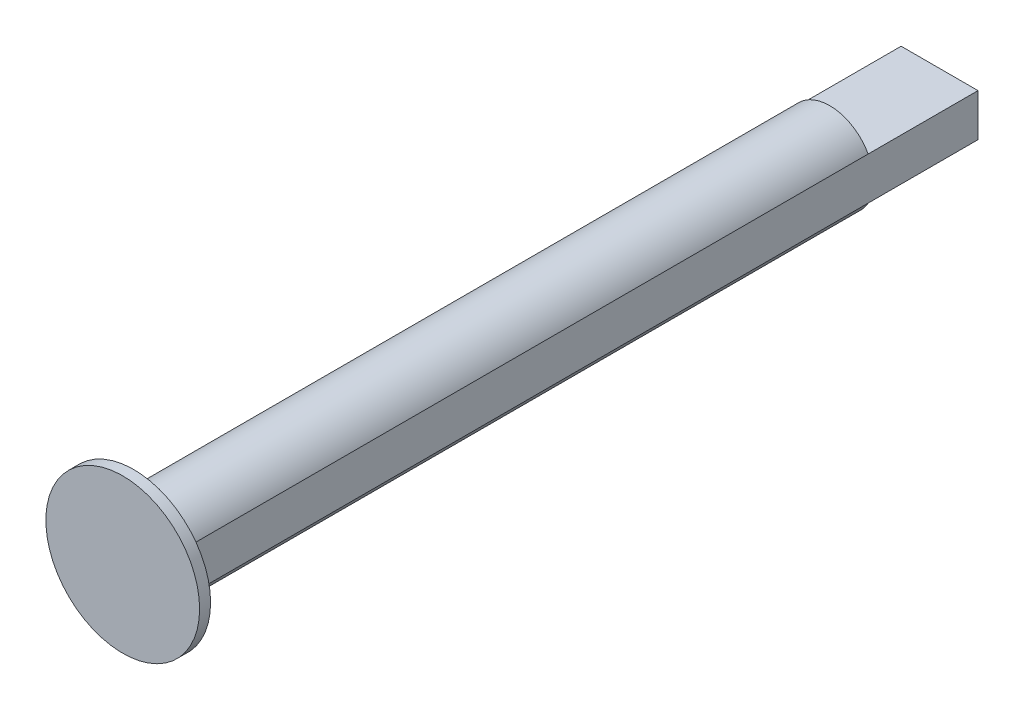
ISO-10303-21;
HEADER;
FILE_DESCRIPTION(('STEP AP214'),'2;1');
FILE_NAME('part.step','',(''),(''),'','','');
FILE_SCHEMA(('AUTOMOTIVE_DESIGN { 1 0 10303 214 1 1 1 1 }'));
ENDSEC;
DATA;
#1=APPLICATION_CONTEXT('core data for automotive mechanical design processes');
#2=APPLICATION_PROTOCOL_DEFINITION('international standard','automotive_design',2000,#1);
#3=PRODUCT_CONTEXT('',#1,'mechanical');
#4=PRODUCT('Part','Part','',(#3));
#5=PRODUCT_RELATED_PRODUCT_CATEGORY('part','',(#4));
#6=PRODUCT_DEFINITION_FORMATION('','',#4);
#7=PRODUCT_DEFINITION_CONTEXT('part definition',#1,'design');
#8=PRODUCT_DEFINITION('design','',#6,#7);
#9=PRODUCT_DEFINITION_SHAPE('','',#8);
#10=(LENGTH_UNIT() NAMED_UNIT(*) SI_UNIT(.MILLI.,.METRE.));
#11=(NAMED_UNIT(*) PLANE_ANGLE_UNIT() SI_UNIT($,.RADIAN.));
#12=(NAMED_UNIT(*) SI_UNIT($,.STERADIAN.) SOLID_ANGLE_UNIT());
#13=UNCERTAINTY_MEASURE_WITH_UNIT(LENGTH_MEASURE(1.E-05),#10,'distance_accuracy_value','');
#14=(GEOMETRIC_REPRESENTATION_CONTEXT(3) GLOBAL_UNCERTAINTY_ASSIGNED_CONTEXT((#13)) GLOBAL_UNIT_ASSIGNED_CONTEXT((#10,
#11,#12)) REPRESENTATION_CONTEXT('',''));
#15=CARTESIAN_POINT('',(0.,0.,0.));
#16=DIRECTION('',(0.,0.,1.));
#17=DIRECTION('',(1.,0.,0.));
#18=AXIS2_PLACEMENT_3D('',#15,#16,#17);
#19=CARTESIAN_POINT('',(0.,0.,-73.3796339));
#20=DIRECTION('',(0.,0.,1.));
#21=DIRECTION('',(1.,0.,0.));
#22=AXIS2_PLACEMENT_3D('',#19,#20,#21);
#23=CYLINDRICAL_SURFACE('',#22,4.);
#24=DIRECTION('',(0.,0.,-1.));
#25=VECTOR('',#24,1.);
#26=CARTESIAN_POINT('',(-3.5,-1.93649167310371,-63.3796339));
#27=LINE('',#26,#25);
#28=CARTESIAN_POINT('',(-3.5,-1.93649167310371,-63.3796339));
#29=VERTEX_POINT('',#28);
#30=CARTESIAN_POINT('',(-3.5,-1.93649167310371,-73.3796339));
#31=VERTEX_POINT('',#30);
#32=EDGE_CURVE('E60',#29,#31,#27,.T.);
#33=ORIENTED_EDGE('',*,*,#32,.F.);
#34=CARTESIAN_POINT('',(0.,0.,-63.3796339));
#35=DIRECTION('',(0.,0.,-1.));
#36=DIRECTION('',(-1.,0.,0.));
#37=AXIS2_PLACEMENT_3D('',#34,#35,#36);
#38=CIRCLE('',#37,4.);
#39=CARTESIAN_POINT('',(3.5,-1.93649167310371,-63.3796339));
#40=VERTEX_POINT('',#39);
#41=EDGE_CURVE('E92',#40,#29,#38,.T.);
#42=ORIENTED_EDGE('',*,*,#41,.F.);
#43=DIRECTION('',(0.,0.,1.));
#44=VECTOR('',#43,1.);
#45=CARTESIAN_POINT('',(3.5,-1.93649167310371,-73.3796339));
#46=LINE('',#45,#44);
#47=CARTESIAN_POINT('',(3.5,-1.93649167310371,0.));
#48=VERTEX_POINT('',#47);
#49=EDGE_CURVE('E141',#40,#48,#46,.T.);
#50=ORIENTED_EDGE('',*,*,#49,.T.);
#51=CARTESIAN_POINT('',(0.,0.,0.));
#52=DIRECTION('',(0.,0.,1.));
#53=DIRECTION('',(1.,0.,0.));
#54=AXIS2_PLACEMENT_3D('',#51,#52,#53);
#55=CIRCLE('',#54,4.);
#56=CARTESIAN_POINT('',(3.5,1.93649167310371,0.));
#57=VERTEX_POINT('',#56);
#58=EDGE_CURVE('E132',#57,#48,#55,.T.);
#59=ORIENTED_EDGE('',*,*,#58,.F.);
#60=DIRECTION('',(0.,0.,1.));
#61=VECTOR('',#60,1.);
#62=CARTESIAN_POINT('',(3.5,1.93649167310371,-73.3796339));
#63=LINE('',#62,#61);
#64=CARTESIAN_POINT('',(3.5,1.93649167310371,-63.3796339));
#65=VERTEX_POINT('',#64);
#66=EDGE_CURVE('E53',#65,#57,#63,.T.);
#67=ORIENTED_EDGE('',*,*,#66,.F.);
#68=CARTESIAN_POINT('',(0.,0.,-63.3796339));
#69=DIRECTION('',(0.,0.,-1.));
#70=DIRECTION('',(-1.,0.,0.));
#71=AXIS2_PLACEMENT_3D('',#68,#69,#70);
#72=CIRCLE('',#71,4.);
#73=CARTESIAN_POINT('',(-3.5,1.93649167310371,-63.3796339));
#74=VERTEX_POINT('',#73);
#75=EDGE_CURVE('E124',#74,#65,#72,.T.);
#76=ORIENTED_EDGE('',*,*,#75,.F.);
#77=DIRECTION('',(0.,0.,-1.));
#78=VECTOR('',#77,1.);
#79=CARTESIAN_POINT('',(-3.5,1.93649167310371,-63.3796339));
#80=LINE('',#79,#78);
#81=CARTESIAN_POINT('',(-3.5,1.93649167310371,-73.3796339));
#82=VERTEX_POINT('',#81);
#83=EDGE_CURVE('E117',#74,#82,#80,.T.);
#84=ORIENTED_EDGE('',*,*,#83,.T.);
#85=CARTESIAN_POINT('',(0.,0.,-73.3796339));
#86=DIRECTION('',(0.,0.,1.));
#87=DIRECTION('',(1.,0.,0.));
#88=AXIS2_PLACEMENT_3D('',#85,#86,#87);
#89=CIRCLE('',#88,4.);
#90=EDGE_CURVE('E107',#82,#31,#89,.T.);
#91=ORIENTED_EDGE('',*,*,#90,.T.);
#92=EDGE_LOOP('',(#33,#42,#50,#59,#67,#76,#84,#91));
#93=FACE_BOUND('',#92,.T.);
#94=ADVANCED_FACE('F44',(#93),#23,.T.);
#95=CARTESIAN_POINT('',(3.5,-1.93649167310371,-73.3796339));
#96=DIRECTION('',(1.,0.,0.));
#97=DIRECTION('',(0.,0.,-1.));
#98=AXIS2_PLACEMENT_3D('',#95,#96,#97);
#99=PLANE('',#98);
#100=DIRECTION('',(0.,1.,0.));
#101=VECTOR('',#100,1.);
#102=CARTESIAN_POINT('',(3.5,-1.93649167310371,0.));
#103=LINE('',#102,#101);
#104=EDGE_CURVE('E137',#48,#57,#103,.T.);
#105=ORIENTED_EDGE('',*,*,#104,.F.);
#106=ORIENTED_EDGE('',*,*,#49,.F.);
#107=CARTESIAN_POINT('',(3.5,-1.93649167310371,-73.3796339));
#108=VERTEX_POINT('',#107);
#109=EDGE_CURVE('E47',#108,#40,#46,.T.);
#110=ORIENTED_EDGE('',*,*,#109,.F.);
#111=DIRECTION('',(0.,1.,0.));
#112=VECTOR('',#111,1.);
#113=CARTESIAN_POINT('',(3.5,-1.93649167310371,-73.3796339));
#114=LINE('',#113,#112);
#115=CARTESIAN_POINT('',(3.5,1.93649167310371,-73.3796339));
#116=VERTEX_POINT('',#115);
#117=EDGE_CURVE('E136',#108,#116,#114,.T.);
#118=ORIENTED_EDGE('',*,*,#117,.T.);
#119=EDGE_CURVE('E11',#116,#65,#63,.T.);
#120=ORIENTED_EDGE('',*,*,#119,.T.);
#121=ORIENTED_EDGE('',*,*,#66,.T.);
#122=EDGE_LOOP('',(#105,#106,#110,#118,#120,#121));
#123=FACE_BOUND('',#122,.T.);
#124=ADVANCED_FACE('F152',(#123),#99,.T.);
#125=CARTESIAN_POINT('',(0.,0.,-73.3796339));
#126=DIRECTION('',(0.,0.,1.));
#127=DIRECTION('',(1.,0.,0.));
#128=AXIS2_PLACEMENT_3D('',#125,#126,#127);
#129=PLANE('',#128);
#130=ORIENTED_EDGE('',*,*,#117,.F.);
#131=DIRECTION('',(1.,0.,0.));
#132=VECTOR('',#131,1.);
#133=CARTESIAN_POINT('',(3.5,-1.93649167310371,-73.3796339));
#134=LINE('',#133,#132);
#135=EDGE_CURVE('E98',#31,#108,#134,.T.);
#136=ORIENTED_EDGE('',*,*,#135,.F.);
#137=ORIENTED_EDGE('',*,*,#90,.F.);
#138=DIRECTION('',(-1.,0.,0.));
#139=VECTOR('',#138,1.);
#140=CARTESIAN_POINT('',(3.5,1.93649167310371,-73.3796339));
#141=LINE('',#140,#139);
#142=EDGE_CURVE('E121',#116,#82,#141,.T.);
#143=ORIENTED_EDGE('',*,*,#142,.F.);
#144=EDGE_LOOP('',(#130,#136,#137,#143));
#145=FACE_BOUND('',#144,.T.);
#146=ADVANCED_FACE('F163',(#145),#129,.F.);
#147=CARTESIAN_POINT('',(0.,0.,0.));
#148=DIRECTION('',(0.,0.,1.));
#149=DIRECTION('',(1.,0.,0.));
#150=AXIS2_PLACEMENT_3D('',#147,#148,#149);
#151=PLANE('',#150);
#152=CARTESIAN_POINT('',(0.,0.,0.));
#153=DIRECTION('',(0.,0.,1.));
#154=DIRECTION('',(1.,0.,0.));
#155=AXIS2_PLACEMENT_3D('',#152,#153,#154);
#156=CIRCLE('',#155,7.);
#157=CARTESIAN_POINT('',(7.,0.,0.));
#158=VERTEX_POINT('',#157);
#159=EDGE_CURVE('E109',#158,#158,#156,.T.);
#160=ORIENTED_EDGE('',*,*,#159,.F.);
#161=EDGE_LOOP('',(#160));
#162=FACE_BOUND('',#161,.T.);
#163=ORIENTED_EDGE('',*,*,#104,.T.);
#164=ORIENTED_EDGE('',*,*,#58,.T.);
#165=EDGE_LOOP('',(#163,#164));
#166=FACE_BOUND('',#165,.T.);
#167=ADVANCED_FACE('F149',(#162,#166),#151,.F.);
#168=CARTESIAN_POINT('',(0.,0.,1.));
#169=DIRECTION('',(0.,0.,-1.));
#170=DIRECTION('',(-1.,0.,0.));
#171=AXIS2_PLACEMENT_3D('',#168,#169,#170);
#172=CYLINDRICAL_SURFACE('',#171,7.);
#173=CARTESIAN_POINT('',(0.,0.,1.));
#174=DIRECTION('',(0.,0.,1.));
#175=DIRECTION('',(1.,0.,0.));
#176=AXIS2_PLACEMENT_3D('',#173,#174,#175);
#177=CIRCLE('',#176,7.);
#178=CARTESIAN_POINT('',(7.,0.,1.));
#179=VERTEX_POINT('',#178);
#180=EDGE_CURVE('E113',#179,#179,#177,.T.);
#181=ORIENTED_EDGE('',*,*,#180,.F.);
#182=EDGE_LOOP('',(#181));
#183=FACE_BOUND('',#182,.T.);
#184=ORIENTED_EDGE('',*,*,#159,.T.);
#185=EDGE_LOOP('',(#184));
#186=FACE_BOUND('',#185,.T.);
#187=ADVANCED_FACE('F172',(#183,#186),#172,.T.);
#188=CARTESIAN_POINT('',(0.,0.,1.));
#189=DIRECTION('',(0.,0.,1.));
#190=DIRECTION('',(1.,0.,0.));
#191=AXIS2_PLACEMENT_3D('',#188,#189,#190);
#192=PLANE('',#191);
#193=ORIENTED_EDGE('',*,*,#180,.T.);
#194=EDGE_LOOP('',(#193));
#195=FACE_BOUND('',#194,.T.);
#196=ADVANCED_FACE('F184',(#195),#192,.T.);
#197=CARTESIAN_POINT('',(3.5,1.93649167310371,-63.3796339));
#198=DIRECTION('',(0.,-1.,0.));
#199=DIRECTION('',(0.,0.,-1.));
#200=AXIS2_PLACEMENT_3D('',#197,#198,#199);
#201=PLANE('',#200);
#202=ORIENTED_EDGE('',*,*,#142,.T.);
#203=ORIENTED_EDGE('',*,*,#83,.F.);
#204=DIRECTION('',(-1.,0.,0.));
#205=VECTOR('',#204,1.);
#206=CARTESIAN_POINT('',(3.5,1.93649167310371,-63.3796339));
#207=LINE('',#206,#205);
#208=EDGE_CURVE('E120',#65,#74,#207,.T.);
#209=ORIENTED_EDGE('',*,*,#208,.F.);
#210=ORIENTED_EDGE('',*,*,#119,.F.);
#211=EDGE_LOOP('',(#202,#203,#209,#210));
#212=FACE_BOUND('',#211,.T.);
#213=ADVANCED_FACE('F160',(#212),#201,.F.);
#214=CARTESIAN_POINT('',(0.,0.,-63.3796339));
#215=DIRECTION('',(0.,0.,-1.));
#216=DIRECTION('',(-1.,0.,0.));
#217=AXIS2_PLACEMENT_3D('',#214,#215,#216);
#218=PLANE('',#217);
#219=ORIENTED_EDGE('',*,*,#75,.T.);
#220=ORIENTED_EDGE('',*,*,#208,.T.);
#221=EDGE_LOOP('',(#219,#220));
#222=FACE_BOUND('',#221,.T.);
#223=ADVANCED_FACE('F159',(#222),#218,.T.);
#224=CARTESIAN_POINT('',(3.5,-1.93649167310371,-63.3796339));
#225=DIRECTION('',(0.,1.,0.));
#226=DIRECTION('',(0.,0.,1.));
#227=AXIS2_PLACEMENT_3D('',#224,#225,#226);
#228=PLANE('',#227);
#229=ORIENTED_EDGE('',*,*,#135,.T.);
#230=ORIENTED_EDGE('',*,*,#109,.T.);
#231=DIRECTION('',(1.,0.,0.));
#232=VECTOR('',#231,1.);
#233=CARTESIAN_POINT('',(3.5,-1.93649167310371,-63.3796339));
#234=LINE('',#233,#232);
#235=EDGE_CURVE('E94',#29,#40,#234,.T.);
#236=ORIENTED_EDGE('',*,*,#235,.F.);
#237=ORIENTED_EDGE('',*,*,#32,.T.);
#238=EDGE_LOOP('',(#229,#230,#236,#237));
#239=FACE_BOUND('',#238,.T.);
#240=ADVANCED_FACE('F100',(#239),#228,.F.);
#241=CARTESIAN_POINT('',(0.,0.,-63.3796339));
#242=DIRECTION('',(0.,0.,-1.));
#243=DIRECTION('',(-1.,0.,0.));
#244=AXIS2_PLACEMENT_3D('',#241,#242,#243);
#245=PLANE('',#244);
#246=ORIENTED_EDGE('',*,*,#41,.T.);
#247=ORIENTED_EDGE('',*,*,#235,.T.);
#248=EDGE_LOOP('',(#246,#247));
#249=FACE_BOUND('',#248,.T.);
#250=ADVANCED_FACE('F93',(#249),#245,.T.);
#251=CLOSED_SHELL('',(#94,#124,#146,#167,#187,#196,#213,#223,#240,#250));
#252=MANIFOLD_SOLID_BREP('B2',#251);
#253=ADVANCED_BREP_SHAPE_REPRESENTATION('',(#18,#252),#14);
#254=SHAPE_DEFINITION_REPRESENTATION(#9,#253);
ENDSEC;
END-ISO-10303-21;
